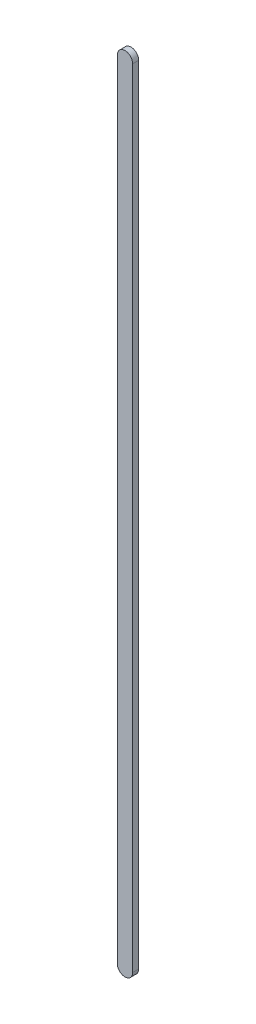
ISO-10303-21;
HEADER;
FILE_DESCRIPTION(('STEP AP214'),'2;1');
FILE_NAME('part.step','',(''),(''),'','','');
FILE_SCHEMA(('AUTOMOTIVE_DESIGN { 1 0 10303 214 1 1 1 1 }'));
ENDSEC;
DATA;
#1=APPLICATION_CONTEXT('core data for automotive mechanical design processes');
#2=APPLICATION_PROTOCOL_DEFINITION('international standard','automotive_design',2000,#1);
#3=PRODUCT_CONTEXT('',#1,'mechanical');
#4=PRODUCT('Part','Part','',(#3));
#5=PRODUCT_RELATED_PRODUCT_CATEGORY('part','',(#4));
#6=PRODUCT_DEFINITION_FORMATION('','',#4);
#7=PRODUCT_DEFINITION_CONTEXT('part definition',#1,'design');
#8=PRODUCT_DEFINITION('design','',#6,#7);
#9=PRODUCT_DEFINITION_SHAPE('','',#8);
#10=(LENGTH_UNIT() NAMED_UNIT(*) SI_UNIT(.MILLI.,.METRE.));
#11=(NAMED_UNIT(*) PLANE_ANGLE_UNIT() SI_UNIT($,.RADIAN.));
#12=(NAMED_UNIT(*) SI_UNIT($,.STERADIAN.) SOLID_ANGLE_UNIT());
#13=UNCERTAINTY_MEASURE_WITH_UNIT(LENGTH_MEASURE(1.E-05),#10,'distance_accuracy_value','');
#14=(GEOMETRIC_REPRESENTATION_CONTEXT(3) GLOBAL_UNCERTAINTY_ASSIGNED_CONTEXT((#13)) GLOBAL_UNIT_ASSIGNED_CONTEXT((#10,
#11,#12)) REPRESENTATION_CONTEXT('',''));
#15=CARTESIAN_POINT('',(0.,0.,0.));
#16=DIRECTION('',(0.,0.,1.));
#17=DIRECTION('',(1.,0.,0.));
#18=AXIS2_PLACEMENT_3D('',#15,#16,#17);
#19=CARTESIAN_POINT('',(131.953,80.2610028,0.));
#20=DIRECTION('',(-1.,0.,0.));
#21=DIRECTION('',(0.,1.,0.));
#22=AXIS2_PLACEMENT_3D('',#19,#20,#21);
#23=PLANE('',#22);
#24=DIRECTION('',(0.,1.,0.));
#25=VECTOR('',#24,1.);
#26=CARTESIAN_POINT('',(131.953,80.2610028,0.1999996));
#27=LINE('',#26,#25);
#28=CARTESIAN_POINT('',(131.953,80.2610028,0.1999996));
#29=VERTEX_POINT('',#28);
#30=CARTESIAN_POINT('',(131.953,106.4006,0.1999996));
#31=VERTEX_POINT('',#30);
#32=EDGE_CURVE('E11',#29,#31,#27,.T.);
#33=ORIENTED_EDGE('',*,*,#32,.F.);
#34=DIRECTION('',(0.,0.,1.));
#35=VECTOR('',#34,1.);
#36=CARTESIAN_POINT('',(131.953,80.2610028,0.));
#37=LINE('',#36,#35);
#38=CARTESIAN_POINT('',(131.953,80.2610028,0.));
#39=VERTEX_POINT('',#38);
#40=EDGE_CURVE('E24',#39,#29,#37,.T.);
#41=ORIENTED_EDGE('',*,*,#40,.F.);
#42=DIRECTION('',(0.,1.,0.));
#43=VECTOR('',#42,1.);
#44=CARTESIAN_POINT('',(131.953,80.2610028,0.));
#45=LINE('',#44,#43);
#46=CARTESIAN_POINT('',(131.953,106.4006,0.));
#47=VERTEX_POINT('',#46);
#48=EDGE_CURVE('E75',#39,#47,#45,.T.);
#49=ORIENTED_EDGE('',*,*,#48,.T.);
#50=DIRECTION('',(0.,0.,1.));
#51=VECTOR('',#50,1.);
#52=CARTESIAN_POINT('',(131.953,106.4006,0.));
#53=LINE('',#52,#51);
#54=EDGE_CURVE('E37',#47,#31,#53,.T.);
#55=ORIENTED_EDGE('',*,*,#54,.T.);
#56=EDGE_LOOP('',(#33,#41,#49,#55));
#57=FACE_BOUND('',#56,.T.);
#58=ADVANCED_FACE('F17',(#57),#23,.F.);
#59=CARTESIAN_POINT('',(131.699,106.4006,0.));
#60=DIRECTION('',(0.,0.,-1.));
#61=DIRECTION('',(1.,0.,0.));
#62=AXIS2_PLACEMENT_3D('',#59,#60,#61);
#63=CYLINDRICAL_SURFACE('',#62,0.254000000000005);
#64=CARTESIAN_POINT('',(131.699,106.4006,0.1999996));
#65=DIRECTION('',(0.,0.,1.));
#66=DIRECTION('',(1.,0.,0.));
#67=AXIS2_PLACEMENT_3D('',#64,#65,#66);
#68=CIRCLE('',#67,0.254000000000005);
#69=CARTESIAN_POINT('',(131.445,106.4006,0.1999996));
#70=VERTEX_POINT('',#69);
#71=EDGE_CURVE('E83',#31,#70,#68,.T.);
#72=ORIENTED_EDGE('',*,*,#71,.F.);
#73=ORIENTED_EDGE('',*,*,#54,.F.);
#74=CARTESIAN_POINT('',(131.699,106.4006,0.));
#75=DIRECTION('',(0.,0.,1.));
#76=DIRECTION('',(1.,0.,0.));
#77=AXIS2_PLACEMENT_3D('',#74,#75,#76);
#78=CIRCLE('',#77,0.254000000000005);
#79=CARTESIAN_POINT('',(131.445,106.4006,0.));
#80=VERTEX_POINT('',#79);
#81=EDGE_CURVE('E81',#47,#80,#78,.T.);
#82=ORIENTED_EDGE('',*,*,#81,.T.);
#83=DIRECTION('',(0.,0.,1.));
#84=VECTOR('',#83,1.);
#85=CARTESIAN_POINT('',(131.445,106.4006,0.));
#86=LINE('',#85,#84);
#87=EDGE_CURVE('E67',#80,#70,#86,.T.);
#88=ORIENTED_EDGE('',*,*,#87,.T.);
#89=EDGE_LOOP('',(#72,#73,#82,#88));
#90=FACE_BOUND('',#89,.T.);
#91=ADVANCED_FACE('F89',(#90),#63,.T.);
#92=CARTESIAN_POINT('',(131.445,106.4006,0.));
#93=DIRECTION('',(1.,0.,0.));
#94=DIRECTION('',(0.,-1.,0.));
#95=AXIS2_PLACEMENT_3D('',#92,#93,#94);
#96=PLANE('',#95);
#97=DIRECTION('',(0.,-1.,0.));
#98=VECTOR('',#97,1.);
#99=CARTESIAN_POINT('',(131.445,106.4006,0.1999996));
#100=LINE('',#99,#98);
#101=CARTESIAN_POINT('',(131.445,80.2610028,0.1999996));
#102=VERTEX_POINT('',#101);
#103=EDGE_CURVE('E71',#70,#102,#100,.T.);
#104=ORIENTED_EDGE('',*,*,#103,.F.);
#105=ORIENTED_EDGE('',*,*,#87,.F.);
#106=DIRECTION('',(0.,-1.,0.));
#107=VECTOR('',#106,1.);
#108=CARTESIAN_POINT('',(131.445,106.4006,0.));
#109=LINE('',#108,#107);
#110=CARTESIAN_POINT('',(131.445,80.2610028,0.));
#111=VERTEX_POINT('',#110);
#112=EDGE_CURVE('E63',#80,#111,#109,.T.);
#113=ORIENTED_EDGE('',*,*,#112,.T.);
#114=DIRECTION('',(0.,0.,1.));
#115=VECTOR('',#114,1.);
#116=CARTESIAN_POINT('',(131.445,80.2610028,0.));
#117=LINE('',#116,#115);
#118=EDGE_CURVE('E53',#111,#102,#117,.T.);
#119=ORIENTED_EDGE('',*,*,#118,.T.);
#120=EDGE_LOOP('',(#104,#105,#113,#119));
#121=FACE_BOUND('',#120,.T.);
#122=ADVANCED_FACE('F66',(#121),#96,.F.);
#123=CARTESIAN_POINT('',(131.699,80.2610028,0.));
#124=DIRECTION('',(0.,0.,-1.));
#125=DIRECTION('',(-1.,0.,0.));
#126=AXIS2_PLACEMENT_3D('',#123,#124,#125);
#127=CYLINDRICAL_SURFACE('',#126,0.254000000000005);
#128=CARTESIAN_POINT('',(131.699,80.2610028,0.1999996));
#129=DIRECTION('',(0.,0.,1.));
#130=DIRECTION('',(-1.,0.,0.));
#131=AXIS2_PLACEMENT_3D('',#128,#129,#130);
#132=CIRCLE('',#131,0.254000000000005);
#133=EDGE_CURVE('E59',#102,#29,#132,.T.);
#134=ORIENTED_EDGE('',*,*,#133,.F.);
#135=ORIENTED_EDGE('',*,*,#118,.F.);
#136=CARTESIAN_POINT('',(131.699,80.2610028,0.));
#137=DIRECTION('',(0.,0.,1.));
#138=DIRECTION('',(-1.,0.,0.));
#139=AXIS2_PLACEMENT_3D('',#136,#137,#138);
#140=CIRCLE('',#139,0.254000000000005);
#141=EDGE_CURVE('E57',#111,#39,#140,.T.);
#142=ORIENTED_EDGE('',*,*,#141,.T.);
#143=ORIENTED_EDGE('',*,*,#40,.T.);
#144=EDGE_LOOP('',(#134,#135,#142,#143));
#145=FACE_BOUND('',#144,.T.);
#146=ADVANCED_FACE('F55',(#145),#127,.T.);
#147=CARTESIAN_POINT('',(131.953,80.2610028,0.));
#148=DIRECTION('',(0.,0.,-1.));
#149=DIRECTION('',(-1.,0.,0.));
#150=AXIS2_PLACEMENT_3D('',#147,#148,#149);
#151=PLANE('',#150);
#152=ORIENTED_EDGE('',*,*,#141,.F.);
#153=ORIENTED_EDGE('',*,*,#112,.F.);
#154=ORIENTED_EDGE('',*,*,#81,.F.);
#155=ORIENTED_EDGE('',*,*,#48,.F.);
#156=EDGE_LOOP('',(#152,#153,#154,#155));
#157=FACE_BOUND('',#156,.T.);
#158=ADVANCED_FACE('F74',(#157),#151,.T.);
#159=CARTESIAN_POINT('',(131.953,80.2610028,0.1999996));
#160=DIRECTION('',(0.,0.,-1.));
#161=DIRECTION('',(-1.,0.,0.));
#162=AXIS2_PLACEMENT_3D('',#159,#160,#161);
#163=PLANE('',#162);
#164=ORIENTED_EDGE('',*,*,#32,.T.);
#165=ORIENTED_EDGE('',*,*,#71,.T.);
#166=ORIENTED_EDGE('',*,*,#103,.T.);
#167=ORIENTED_EDGE('',*,*,#133,.T.);
#168=EDGE_LOOP('',(#164,#165,#166,#167));
#169=FACE_BOUND('',#168,.T.);
#170=ADVANCED_FACE('F91',(#169),#163,.F.);
#171=CLOSED_SHELL('',(#58,#91,#122,#146,#158,#170));
#172=MANIFOLD_SOLID_BREP('B1',#171);
#173=ADVANCED_BREP_SHAPE_REPRESENTATION('',(#18,#172),#14);
#174=SHAPE_DEFINITION_REPRESENTATION(#9,#173);
ENDSEC;
END-ISO-10303-21;
